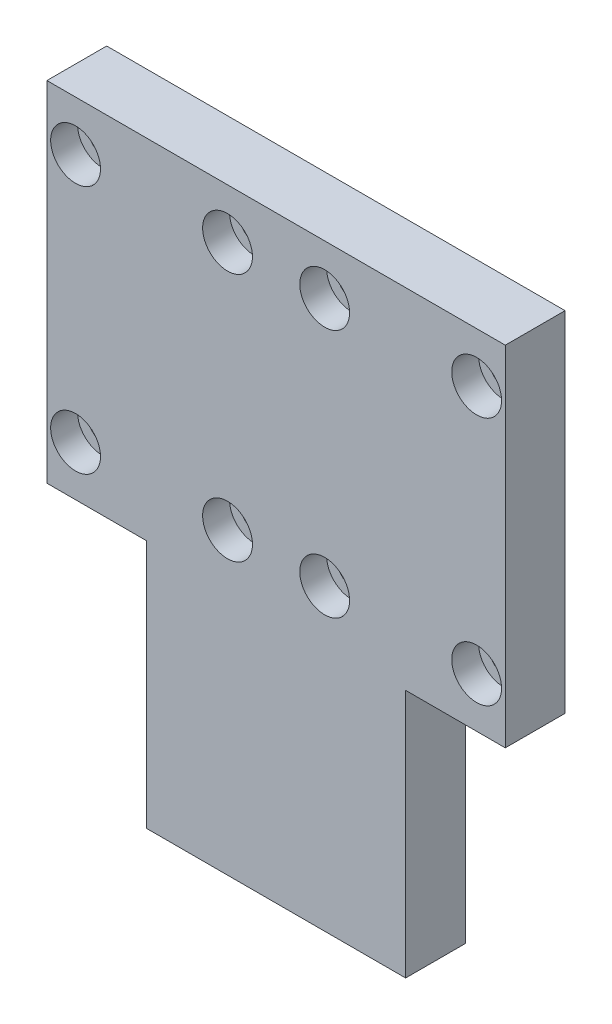
ISO-10303-21;
HEADER;
FILE_DESCRIPTION(('STEP AP214'),'2;1');
FILE_NAME('part.step','',(''),(''),'','','');
FILE_SCHEMA(('AUTOMOTIVE_DESIGN { 1 0 10303 214 1 1 1 1 }'));
ENDSEC;
DATA;
#1=APPLICATION_CONTEXT('core data for automotive mechanical design processes');
#2=APPLICATION_PROTOCOL_DEFINITION('international standard','automotive_design',2000,#1);
#3=PRODUCT_CONTEXT('',#1,'mechanical');
#4=PRODUCT('Part','Part','',(#3));
#5=PRODUCT_RELATED_PRODUCT_CATEGORY('part','',(#4));
#6=PRODUCT_DEFINITION_FORMATION('','',#4);
#7=PRODUCT_DEFINITION_CONTEXT('part definition',#1,'design');
#8=PRODUCT_DEFINITION('design','',#6,#7);
#9=PRODUCT_DEFINITION_SHAPE('','',#8);
#10=(LENGTH_UNIT() NAMED_UNIT(*) SI_UNIT(.MILLI.,.METRE.));
#11=(NAMED_UNIT(*) PLANE_ANGLE_UNIT() SI_UNIT($,.RADIAN.));
#12=(NAMED_UNIT(*) SI_UNIT($,.STERADIAN.) SOLID_ANGLE_UNIT());
#13=UNCERTAINTY_MEASURE_WITH_UNIT(LENGTH_MEASURE(1.E-05),#10,'distance_accuracy_value','');
#14=(GEOMETRIC_REPRESENTATION_CONTEXT(3) GLOBAL_UNCERTAINTY_ASSIGNED_CONTEXT((#13)) GLOBAL_UNIT_ASSIGNED_CONTEXT((#10,
#11,#12)) REPRESENTATION_CONTEXT('',''));
#15=CARTESIAN_POINT('',(0.,0.,0.));
#16=DIRECTION('',(0.,0.,1.));
#17=DIRECTION('',(1.,0.,0.));
#18=AXIS2_PLACEMENT_3D('',#15,#16,#17);
#19=CARTESIAN_POINT('',(46.,-60.,12.));
#20=DIRECTION('',(0.,1.,0.));
#21=DIRECTION('',(-1.,0.,0.));
#22=AXIS2_PLACEMENT_3D('',#19,#20,#21);
#23=PLANE('',#22);
#24=DIRECTION('',(0.,0.,1.));
#25=VECTOR('',#24,1.);
#26=CARTESIAN_POINT('',(26.,-60.,-0.000999999999999265));
#27=LINE('',#26,#25);
#28=CARTESIAN_POINT('',(26.,-60.,0.));
#29=VERTEX_POINT('',#28);
#30=CARTESIAN_POINT('',(26.,-60.,12.));
#31=VERTEX_POINT('',#30);
#32=EDGE_CURVE('E105',#29,#31,#27,.T.);
#33=ORIENTED_EDGE('',*,*,#32,.T.);
#34=DIRECTION('',(1.,0.,0.));
#35=VECTOR('',#34,1.);
#36=CARTESIAN_POINT('',(46.,-60.,12.));
#37=LINE('',#36,#35);
#38=CARTESIAN_POINT('',(-26.,-60.,12.));
#39=VERTEX_POINT('',#38);
#40=EDGE_CURVE('E137',#39,#31,#37,.T.);
#41=ORIENTED_EDGE('',*,*,#40,.F.);
#42=DIRECTION('',(0.,0.,1.));
#43=VECTOR('',#42,1.);
#44=CARTESIAN_POINT('',(-26.,-60.,-0.000999999999999265));
#45=LINE('',#44,#43);
#46=CARTESIAN_POINT('',(-26.,-60.,0.));
#47=VERTEX_POINT('',#46);
#48=EDGE_CURVE('E163',#47,#39,#45,.T.);
#49=ORIENTED_EDGE('',*,*,#48,.F.);
#50=DIRECTION('',(1.,0.,0.));
#51=VECTOR('',#50,1.);
#52=CARTESIAN_POINT('',(46.,-60.,0.));
#53=LINE('',#52,#51);
#54=EDGE_CURVE('E119',#47,#29,#53,.T.);
#55=ORIENTED_EDGE('',*,*,#54,.T.);
#56=EDGE_LOOP('',(#33,#41,#49,#55));
#57=FACE_BOUND('',#56,.T.);
#58=ADVANCED_FACE('F33',(#57),#23,.F.);
#59=CARTESIAN_POINT('',(46.,-60.,12.));
#60=DIRECTION('',(-1.,0.,0.));
#61=DIRECTION('',(0.,0.,1.));
#62=AXIS2_PLACEMENT_3D('',#59,#60,#61);
#63=PLANE('',#62);
#64=DIRECTION('',(0.,0.,1.));
#65=VECTOR('',#64,1.);
#66=CARTESIAN_POINT('',(46.,-10.,-0.000999999999999265));
#67=LINE('',#66,#65);
#68=CARTESIAN_POINT('',(46.,-10.,0.));
#69=VERTEX_POINT('',#68);
#70=CARTESIAN_POINT('',(46.,-10.,12.));
#71=VERTEX_POINT('',#70);
#72=EDGE_CURVE('E99',#69,#71,#67,.T.);
#73=ORIENTED_EDGE('',*,*,#72,.F.);
#74=DIRECTION('',(0.,1.,0.));
#75=VECTOR('',#74,1.);
#76=CARTESIAN_POINT('',(46.,-60.,0.));
#77=LINE('',#76,#75);
#78=CARTESIAN_POINT('',(46.,60.,0.));
#79=VERTEX_POINT('',#78);
#80=EDGE_CURVE('E111',#69,#79,#77,.T.);
#81=ORIENTED_EDGE('',*,*,#80,.T.);
#82=DIRECTION('',(0.,0.,-1.));
#83=VECTOR('',#82,1.);
#84=CARTESIAN_POINT('',(46.,60.,12.));
#85=LINE('',#84,#83);
#86=CARTESIAN_POINT('',(46.,60.,12.));
#87=VERTEX_POINT('',#86);
#88=EDGE_CURVE('E11',#87,#79,#85,.T.);
#89=ORIENTED_EDGE('',*,*,#88,.F.);
#90=DIRECTION('',(0.,1.,0.));
#91=VECTOR('',#90,1.);
#92=CARTESIAN_POINT('',(46.,-60.,12.));
#93=LINE('',#92,#91);
#94=EDGE_CURVE('E112',#71,#87,#93,.T.);
#95=ORIENTED_EDGE('',*,*,#94,.F.);
#96=EDGE_LOOP('',(#73,#81,#89,#95));
#97=FACE_BOUND('',#96,.T.);
#98=ADVANCED_FACE('F109',(#97),#63,.F.);
#99=CARTESIAN_POINT('',(-46.,60.,12.));
#100=DIRECTION('',(0.,0.,1.));
#101=DIRECTION('',(1.,0.,0.));
#102=AXIS2_PLACEMENT_3D('',#99,#100,#101);
#103=PLANE('',#102);
#104=CARTESIAN_POINT('',(-40.25,0.,12.));
#105=DIRECTION('',(0.,0.,1.));
#106=DIRECTION('',(1.,0.,0.));
#107=AXIS2_PLACEMENT_3D('',#104,#105,#106);
#108=CIRCLE('',#107,5.);
#109=CARTESIAN_POINT('',(-35.25,0.,12.));
#110=VERTEX_POINT('',#109);
#111=EDGE_CURVE('E265',#110,#110,#108,.T.);
#112=ORIENTED_EDGE('',*,*,#111,.F.);
#113=EDGE_LOOP('',(#112));
#114=FACE_BOUND('',#113,.T.);
#115=CARTESIAN_POINT('',(-9.74999999999999,0.,12.));
#116=DIRECTION('',(0.,0.,1.));
#117=DIRECTION('',(1.,0.,0.));
#118=AXIS2_PLACEMENT_3D('',#115,#116,#117);
#119=CIRCLE('',#118,5.);
#120=CARTESIAN_POINT('',(-4.74999999999999,0.,12.));
#121=VERTEX_POINT('',#120);
#122=EDGE_CURVE('E253',#121,#121,#119,.T.);
#123=ORIENTED_EDGE('',*,*,#122,.F.);
#124=EDGE_LOOP('',(#123));
#125=FACE_BOUND('',#124,.T.);
#126=CARTESIAN_POINT('',(-9.75,50.,12.));
#127=DIRECTION('',(0.,0.,1.));
#128=DIRECTION('',(1.,0.,0.));
#129=AXIS2_PLACEMENT_3D('',#126,#127,#128);
#130=CIRCLE('',#129,5.);
#131=CARTESIAN_POINT('',(-4.75,50.,12.));
#132=VERTEX_POINT('',#131);
#133=EDGE_CURVE('E241',#132,#132,#130,.T.);
#134=ORIENTED_EDGE('',*,*,#133,.F.);
#135=EDGE_LOOP('',(#134));
#136=FACE_BOUND('',#135,.T.);
#137=CARTESIAN_POINT('',(-40.25,50.,12.));
#138=DIRECTION('',(0.,0.,1.));
#139=DIRECTION('',(1.,0.,0.));
#140=AXIS2_PLACEMENT_3D('',#137,#138,#139);
#141=CIRCLE('',#140,5.);
#142=CARTESIAN_POINT('',(-35.25,50.,12.));
#143=VERTEX_POINT('',#142);
#144=EDGE_CURVE('E229',#143,#143,#141,.T.);
#145=ORIENTED_EDGE('',*,*,#144,.F.);
#146=EDGE_LOOP('',(#145));
#147=FACE_BOUND('',#146,.T.);
#148=CARTESIAN_POINT('',(40.25,0.,12.));
#149=DIRECTION('',(0.,0.,1.));
#150=DIRECTION('',(1.,0.,0.));
#151=AXIS2_PLACEMENT_3D('',#148,#149,#150);
#152=CIRCLE('',#151,5.);
#153=CARTESIAN_POINT('',(45.25,0.,12.));
#154=VERTEX_POINT('',#153);
#155=EDGE_CURVE('E217',#154,#154,#152,.T.);
#156=ORIENTED_EDGE('',*,*,#155,.F.);
#157=EDGE_LOOP('',(#156));
#158=FACE_BOUND('',#157,.T.);
#159=CARTESIAN_POINT('',(9.74999999999999,0.,12.));
#160=DIRECTION('',(0.,0.,1.));
#161=DIRECTION('',(1.,0.,0.));
#162=AXIS2_PLACEMENT_3D('',#159,#160,#161);
#163=CIRCLE('',#162,5.);
#164=CARTESIAN_POINT('',(14.75,0.,12.));
#165=VERTEX_POINT('',#164);
#166=EDGE_CURVE('E205',#165,#165,#163,.T.);
#167=ORIENTED_EDGE('',*,*,#166,.F.);
#168=EDGE_LOOP('',(#167));
#169=FACE_BOUND('',#168,.T.);
#170=CARTESIAN_POINT('',(9.75,50.,12.));
#171=DIRECTION('',(0.,0.,1.));
#172=DIRECTION('',(1.,0.,0.));
#173=AXIS2_PLACEMENT_3D('',#170,#171,#172);
#174=CIRCLE('',#173,5.);
#175=CARTESIAN_POINT('',(14.75,50.,12.));
#176=VERTEX_POINT('',#175);
#177=EDGE_CURVE('E193',#176,#176,#174,.T.);
#178=ORIENTED_EDGE('',*,*,#177,.F.);
#179=EDGE_LOOP('',(#178));
#180=FACE_BOUND('',#179,.T.);
#181=CARTESIAN_POINT('',(40.25,50.,12.));
#182=DIRECTION('',(0.,0.,1.));
#183=DIRECTION('',(1.,0.,0.));
#184=AXIS2_PLACEMENT_3D('',#181,#182,#183);
#185=CIRCLE('',#184,5.);
#186=CARTESIAN_POINT('',(45.25,50.,12.));
#187=VERTEX_POINT('',#186);
#188=EDGE_CURVE('E178',#187,#187,#185,.T.);
#189=ORIENTED_EDGE('',*,*,#188,.F.);
#190=EDGE_LOOP('',(#189));
#191=FACE_BOUND('',#190,.T.);
#192=ORIENTED_EDGE('',*,*,#40,.T.);
#193=DIRECTION('',(0.,1.,0.));
#194=VECTOR('',#193,1.);
#195=CARTESIAN_POINT('',(26.,-10.,12.));
#196=LINE('',#195,#194);
#197=CARTESIAN_POINT('',(26.,-10.,12.));
#198=VERTEX_POINT('',#197);
#199=EDGE_CURVE('E113',#31,#198,#196,.T.);
#200=ORIENTED_EDGE('',*,*,#199,.T.);
#201=DIRECTION('',(1.,0.,0.));
#202=VECTOR('',#201,1.);
#203=CARTESIAN_POINT('',(46.,-10.,12.));
#204=LINE('',#203,#202);
#205=EDGE_CURVE('E488',#198,#71,#204,.T.);
#206=ORIENTED_EDGE('',*,*,#205,.T.);
#207=ORIENTED_EDGE('',*,*,#94,.T.);
#208=DIRECTION('',(-1.,0.,0.));
#209=VECTOR('',#208,1.);
#210=CARTESIAN_POINT('',(46.,60.,12.));
#211=LINE('',#210,#209);
#212=CARTESIAN_POINT('',(-46.,60.,12.));
#213=VERTEX_POINT('',#212);
#214=EDGE_CURVE('E128',#87,#213,#211,.T.);
#215=ORIENTED_EDGE('',*,*,#214,.T.);
#216=DIRECTION('',(0.,-1.,0.));
#217=VECTOR('',#216,1.);
#218=CARTESIAN_POINT('',(-46.,-60.,12.));
#219=LINE('',#218,#217);
#220=CARTESIAN_POINT('',(-46.,-10.,12.));
#221=VERTEX_POINT('',#220);
#222=EDGE_CURVE('E121',#213,#221,#219,.T.);
#223=ORIENTED_EDGE('',*,*,#222,.T.);
#224=DIRECTION('',(-1.,0.,0.));
#225=VECTOR('',#224,1.);
#226=CARTESIAN_POINT('',(-46.,-10.,12.));
#227=LINE('',#226,#225);
#228=CARTESIAN_POINT('',(-26.,-10.,12.));
#229=VERTEX_POINT('',#228);
#230=EDGE_CURVE('E174',#229,#221,#227,.T.);
#231=ORIENTED_EDGE('',*,*,#230,.F.);
#232=DIRECTION('',(0.,1.,0.));
#233=VECTOR('',#232,1.);
#234=CARTESIAN_POINT('',(-26.,-10.,12.));
#235=LINE('',#234,#233);
#236=EDGE_CURVE('E159',#39,#229,#235,.T.);
#237=ORIENTED_EDGE('',*,*,#236,.F.);
#238=EDGE_LOOP('',(#192,#200,#206,#207,#215,#223,#231,#237));
#239=FACE_BOUND('',#238,.T.);
#240=ADVANCED_FACE('F156',(#114,#125,#136,#147,#158,#169,#180,#191,#239),#103,.T.);
#241=CARTESIAN_POINT('',(-46.,60.,0.));
#242=DIRECTION('',(0.,0.,1.));
#243=DIRECTION('',(1.,0.,0.));
#244=AXIS2_PLACEMENT_3D('',#241,#242,#243);
#245=PLANE('',#244);
#246=CARTESIAN_POINT('',(-40.25,0.,0.));
#247=DIRECTION('',(0.,0.,1.));
#248=DIRECTION('',(1.,0.,0.));
#249=AXIS2_PLACEMENT_3D('',#246,#247,#248);
#250=CIRCLE('',#249,2.75);
#251=CARTESIAN_POINT('',(-37.5,0.,0.));
#252=VERTEX_POINT('',#251);
#253=EDGE_CURVE('E140',#252,#252,#250,.T.);
#254=ORIENTED_EDGE('',*,*,#253,.T.);
#255=EDGE_LOOP('',(#254));
#256=FACE_BOUND('',#255,.T.);
#257=CARTESIAN_POINT('',(-9.74999999999999,0.,0.));
#258=DIRECTION('',(0.,0.,1.));
#259=DIRECTION('',(1.,0.,0.));
#260=AXIS2_PLACEMENT_3D('',#257,#258,#259);
#261=CIRCLE('',#260,2.75);
#262=CARTESIAN_POINT('',(-7.,0.,0.));
#263=VERTEX_POINT('',#262);
#264=EDGE_CURVE('E262',#263,#263,#261,.T.);
#265=ORIENTED_EDGE('',*,*,#264,.T.);
#266=EDGE_LOOP('',(#265));
#267=FACE_BOUND('',#266,.T.);
#268=CARTESIAN_POINT('',(-9.75,50.,0.));
#269=DIRECTION('',(0.,0.,1.));
#270=DIRECTION('',(1.,0.,0.));
#271=AXIS2_PLACEMENT_3D('',#268,#269,#270);
#272=CIRCLE('',#271,2.75);
#273=CARTESIAN_POINT('',(-7.,50.,0.));
#274=VERTEX_POINT('',#273);
#275=EDGE_CURVE('E250',#274,#274,#272,.T.);
#276=ORIENTED_EDGE('',*,*,#275,.T.);
#277=EDGE_LOOP('',(#276));
#278=FACE_BOUND('',#277,.T.);
#279=CARTESIAN_POINT('',(-40.25,50.,0.));
#280=DIRECTION('',(0.,0.,1.));
#281=DIRECTION('',(1.,0.,0.));
#282=AXIS2_PLACEMENT_3D('',#279,#280,#281);
#283=CIRCLE('',#282,2.75);
#284=CARTESIAN_POINT('',(-37.5,50.,0.));
#285=VERTEX_POINT('',#284);
#286=EDGE_CURVE('E238',#285,#285,#283,.T.);
#287=ORIENTED_EDGE('',*,*,#286,.T.);
#288=EDGE_LOOP('',(#287));
#289=FACE_BOUND('',#288,.T.);
#290=CARTESIAN_POINT('',(40.25,0.,0.));
#291=DIRECTION('',(0.,0.,1.));
#292=DIRECTION('',(1.,0.,0.));
#293=AXIS2_PLACEMENT_3D('',#290,#291,#292);
#294=CIRCLE('',#293,2.75);
#295=CARTESIAN_POINT('',(43.,0.,0.));
#296=VERTEX_POINT('',#295);
#297=EDGE_CURVE('E226',#296,#296,#294,.T.);
#298=ORIENTED_EDGE('',*,*,#297,.T.);
#299=EDGE_LOOP('',(#298));
#300=FACE_BOUND('',#299,.T.);
#301=CARTESIAN_POINT('',(9.74999999999999,0.,0.));
#302=DIRECTION('',(0.,0.,1.));
#303=DIRECTION('',(1.,0.,0.));
#304=AXIS2_PLACEMENT_3D('',#301,#302,#303);
#305=CIRCLE('',#304,2.75);
#306=CARTESIAN_POINT('',(12.5,0.,0.));
#307=VERTEX_POINT('',#306);
#308=EDGE_CURVE('E214',#307,#307,#305,.T.);
#309=ORIENTED_EDGE('',*,*,#308,.T.);
#310=EDGE_LOOP('',(#309));
#311=FACE_BOUND('',#310,.T.);
#312=CARTESIAN_POINT('',(9.75,50.,0.));
#313=DIRECTION('',(0.,0.,1.));
#314=DIRECTION('',(1.,0.,0.));
#315=AXIS2_PLACEMENT_3D('',#312,#313,#314);
#316=CIRCLE('',#315,2.75);
#317=CARTESIAN_POINT('',(12.5,50.,0.));
#318=VERTEX_POINT('',#317);
#319=EDGE_CURVE('E202',#318,#318,#316,.T.);
#320=ORIENTED_EDGE('',*,*,#319,.T.);
#321=EDGE_LOOP('',(#320));
#322=FACE_BOUND('',#321,.T.);
#323=CARTESIAN_POINT('',(40.25,50.,0.));
#324=DIRECTION('',(0.,0.,1.));
#325=DIRECTION('',(1.,0.,0.));
#326=AXIS2_PLACEMENT_3D('',#323,#324,#325);
#327=CIRCLE('',#326,2.75);
#328=CARTESIAN_POINT('',(43.,50.,0.));
#329=VERTEX_POINT('',#328);
#330=EDGE_CURVE('E190',#329,#329,#327,.T.);
#331=ORIENTED_EDGE('',*,*,#330,.T.);
#332=EDGE_LOOP('',(#331));
#333=FACE_BOUND('',#332,.T.);
#334=DIRECTION('',(0.,-1.,0.));
#335=VECTOR('',#334,1.);
#336=CARTESIAN_POINT('',(26.,-10.,0.));
#337=LINE('',#336,#335);
#338=CARTESIAN_POINT('',(26.,-10.,0.));
#339=VERTEX_POINT('',#338);
#340=EDGE_CURVE('E487',#339,#29,#337,.T.);
#341=ORIENTED_EDGE('',*,*,#340,.T.);
#342=ORIENTED_EDGE('',*,*,#54,.F.);
#343=DIRECTION('',(0.,-1.,0.));
#344=VECTOR('',#343,1.);
#345=CARTESIAN_POINT('',(-26.,-10.,0.));
#346=LINE('',#345,#344);
#347=CARTESIAN_POINT('',(-26.,-10.,0.));
#348=VERTEX_POINT('',#347);
#349=EDGE_CURVE('E104',#348,#47,#346,.T.);
#350=ORIENTED_EDGE('',*,*,#349,.F.);
#351=DIRECTION('',(1.,0.,0.));
#352=VECTOR('',#351,1.);
#353=CARTESIAN_POINT('',(-46.,-10.,0.));
#354=LINE('',#353,#352);
#355=CARTESIAN_POINT('',(-46.,-10.,0.));
#356=VERTEX_POINT('',#355);
#357=EDGE_CURVE('E56',#356,#348,#354,.T.);
#358=ORIENTED_EDGE('',*,*,#357,.F.);
#359=DIRECTION('',(0.,-1.,0.));
#360=VECTOR('',#359,1.);
#361=CARTESIAN_POINT('',(-46.,-60.,0.));
#362=LINE('',#361,#360);
#363=CARTESIAN_POINT('',(-46.,60.,0.));
#364=VERTEX_POINT('',#363);
#365=EDGE_CURVE('E124',#364,#356,#362,.T.);
#366=ORIENTED_EDGE('',*,*,#365,.F.);
#367=DIRECTION('',(-1.,0.,0.));
#368=VECTOR('',#367,1.);
#369=CARTESIAN_POINT('',(46.,60.,0.));
#370=LINE('',#369,#368);
#371=EDGE_CURVE('E118',#79,#364,#370,.T.);
#372=ORIENTED_EDGE('',*,*,#371,.F.);
#373=ORIENTED_EDGE('',*,*,#80,.F.);
#374=DIRECTION('',(-1.,0.,0.));
#375=VECTOR('',#374,1.);
#376=CARTESIAN_POINT('',(46.,-10.,0.));
#377=LINE('',#376,#375);
#378=EDGE_CURVE('E96',#69,#339,#377,.T.);
#379=ORIENTED_EDGE('',*,*,#378,.T.);
#380=EDGE_LOOP('',(#341,#342,#350,#358,#366,#372,#373,#379));
#381=FACE_BOUND('',#380,.T.);
#382=ADVANCED_FACE('F116',(#256,#267,#278,#289,#300,#311,#322,#333,#381),#245,.F.);
#383=CARTESIAN_POINT('',(-46.,-60.,12.));
#384=DIRECTION('',(1.,0.,0.));
#385=DIRECTION('',(0.,0.,-1.));
#386=AXIS2_PLACEMENT_3D('',#383,#384,#385);
#387=PLANE('',#386);
#388=ORIENTED_EDGE('',*,*,#365,.T.);
#389=DIRECTION('',(0.,0.,1.));
#390=VECTOR('',#389,1.);
#391=CARTESIAN_POINT('',(-46.,-10.,-0.000999999999999265));
#392=LINE('',#391,#390);
#393=EDGE_CURVE('E176',#356,#221,#392,.T.);
#394=ORIENTED_EDGE('',*,*,#393,.T.);
#395=ORIENTED_EDGE('',*,*,#222,.F.);
#396=DIRECTION('',(0.,0.,-1.));
#397=VECTOR('',#396,1.);
#398=CARTESIAN_POINT('',(-46.,60.,12.));
#399=LINE('',#398,#397);
#400=EDGE_CURVE('E41',#213,#364,#399,.T.);
#401=ORIENTED_EDGE('',*,*,#400,.T.);
#402=EDGE_LOOP('',(#388,#394,#395,#401));
#403=FACE_BOUND('',#402,.T.);
#404=ADVANCED_FACE('F35',(#403),#387,.F.);
#405=CARTESIAN_POINT('',(46.,60.,12.));
#406=DIRECTION('',(0.,-1.,0.));
#407=DIRECTION('',(1.,0.,0.));
#408=AXIS2_PLACEMENT_3D('',#405,#406,#407);
#409=PLANE('',#408);
#410=ORIENTED_EDGE('',*,*,#371,.T.);
#411=ORIENTED_EDGE('',*,*,#400,.F.);
#412=ORIENTED_EDGE('',*,*,#214,.F.);
#413=ORIENTED_EDGE('',*,*,#88,.T.);
#414=EDGE_LOOP('',(#410,#411,#412,#413));
#415=FACE_BOUND('',#414,.T.);
#416=ADVANCED_FACE('F319',(#415),#409,.F.);
#417=CARTESIAN_POINT('',(-40.25,0.,12.));
#418=DIRECTION('',(0.,0.,1.));
#419=DIRECTION('',(1.,0.,0.));
#420=AXIS2_PLACEMENT_3D('',#417,#418,#419);
#421=CYLINDRICAL_SURFACE('',#420,2.75);
#422=ORIENTED_EDGE('',*,*,#253,.F.);
#423=EDGE_LOOP('',(#422));
#424=FACE_BOUND('',#423,.T.);
#425=CARTESIAN_POINT('',(-40.25,0.,6.6));
#426=DIRECTION('',(0.,0.,1.));
#427=DIRECTION('',(1.,0.,0.));
#428=AXIS2_PLACEMENT_3D('',#425,#426,#427);
#429=CIRCLE('',#428,2.75);
#430=CARTESIAN_POINT('',(-37.5,0.,6.6));
#431=VERTEX_POINT('',#430);
#432=EDGE_CURVE('E143',#431,#431,#429,.T.);
#433=ORIENTED_EDGE('',*,*,#432,.T.);
#434=EDGE_LOOP('',(#433));
#435=FACE_BOUND('',#434,.T.);
#436=ADVANCED_FACE('F322',(#424,#435),#421,.F.);
#437=CARTESIAN_POINT('',(-37.5,0.,6.6));
#438=DIRECTION('',(0.,0.,-1.));
#439=DIRECTION('',(-1.,0.,0.));
#440=AXIS2_PLACEMENT_3D('',#437,#438,#439);
#441=PLANE('',#440);
#442=ORIENTED_EDGE('',*,*,#432,.F.);
#443=EDGE_LOOP('',(#442));
#444=FACE_BOUND('',#443,.T.);
#445=CARTESIAN_POINT('',(-40.25,0.,6.6));
#446=DIRECTION('',(0.,0.,1.));
#447=DIRECTION('',(1.,0.,0.));
#448=AXIS2_PLACEMENT_3D('',#445,#446,#447);
#449=CIRCLE('',#448,5.);
#450=CARTESIAN_POINT('',(-35.25,0.,6.6));
#451=VERTEX_POINT('',#450);
#452=EDGE_CURVE('E148',#451,#451,#449,.T.);
#453=ORIENTED_EDGE('',*,*,#452,.T.);
#454=EDGE_LOOP('',(#453));
#455=FACE_BOUND('',#454,.T.);
#456=ADVANCED_FACE('F270',(#444,#455),#441,.F.);
#457=CARTESIAN_POINT('',(-40.25,0.,12.));
#458=DIRECTION('',(0.,0.,1.));
#459=DIRECTION('',(1.,0.,0.));
#460=AXIS2_PLACEMENT_3D('',#457,#458,#459);
#461=CYLINDRICAL_SURFACE('',#460,5.);
#462=ORIENTED_EDGE('',*,*,#452,.F.);
#463=EDGE_LOOP('',(#462));
#464=FACE_BOUND('',#463,.T.);
#465=ORIENTED_EDGE('',*,*,#111,.T.);
#466=EDGE_LOOP('',(#465));
#467=FACE_BOUND('',#466,.T.);
#468=ADVANCED_FACE('F272',(#464,#467),#461,.F.);
#469=CARTESIAN_POINT('',(-9.74999999999999,0.,12.));
#470=DIRECTION('',(0.,0.,1.));
#471=DIRECTION('',(1.,0.,0.));
#472=AXIS2_PLACEMENT_3D('',#469,#470,#471);
#473=CYLINDRICAL_SURFACE('',#472,2.75);
#474=ORIENTED_EDGE('',*,*,#264,.F.);
#475=EDGE_LOOP('',(#474));
#476=FACE_BOUND('',#475,.T.);
#477=CARTESIAN_POINT('',(-9.74999999999999,0.,6.6));
#478=DIRECTION('',(0.,0.,1.));
#479=DIRECTION('',(1.,0.,0.));
#480=AXIS2_PLACEMENT_3D('',#477,#478,#479);
#481=CIRCLE('',#480,2.75);
#482=CARTESIAN_POINT('',(-6.99999999999999,0.,6.6));
#483=VERTEX_POINT('',#482);
#484=EDGE_CURVE('E259',#483,#483,#481,.T.);
#485=ORIENTED_EDGE('',*,*,#484,.T.);
#486=EDGE_LOOP('',(#485));
#487=FACE_BOUND('',#486,.T.);
#488=ADVANCED_FACE('F275',(#476,#487),#473,.F.);
#489=CARTESIAN_POINT('',(-6.99999999999999,0.,6.6));
#490=DIRECTION('',(0.,0.,-1.));
#491=DIRECTION('',(-1.,0.,0.));
#492=AXIS2_PLACEMENT_3D('',#489,#490,#491);
#493=PLANE('',#492);
#494=ORIENTED_EDGE('',*,*,#484,.F.);
#495=EDGE_LOOP('',(#494));
#496=FACE_BOUND('',#495,.T.);
#497=CARTESIAN_POINT('',(-9.74999999999999,0.,6.6));
#498=DIRECTION('',(0.,0.,1.));
#499=DIRECTION('',(1.,0.,0.));
#500=AXIS2_PLACEMENT_3D('',#497,#498,#499);
#501=CIRCLE('',#500,5.);
#502=CARTESIAN_POINT('',(-4.75,0.,6.6));
#503=VERTEX_POINT('',#502);
#504=EDGE_CURVE('E256',#503,#503,#501,.T.);
#505=ORIENTED_EDGE('',*,*,#504,.T.);
#506=EDGE_LOOP('',(#505));
#507=FACE_BOUND('',#506,.T.);
#508=ADVANCED_FACE('F334',(#496,#507),#493,.F.);
#509=CARTESIAN_POINT('',(-9.74999999999999,0.,12.));
#510=DIRECTION('',(0.,0.,1.));
#511=DIRECTION('',(1.,0.,0.));
#512=AXIS2_PLACEMENT_3D('',#509,#510,#511);
#513=CYLINDRICAL_SURFACE('',#512,5.);
#514=ORIENTED_EDGE('',*,*,#504,.F.);
#515=EDGE_LOOP('',(#514));
#516=FACE_BOUND('',#515,.T.);
#517=ORIENTED_EDGE('',*,*,#122,.T.);
#518=EDGE_LOOP('',(#517));
#519=FACE_BOUND('',#518,.T.);
#520=ADVANCED_FACE('F338',(#516,#519),#513,.F.);
#521=CARTESIAN_POINT('',(-9.75,50.,12.));
#522=DIRECTION('',(0.,0.,1.));
#523=DIRECTION('',(1.,0.,0.));
#524=AXIS2_PLACEMENT_3D('',#521,#522,#523);
#525=CYLINDRICAL_SURFACE('',#524,2.75);
#526=ORIENTED_EDGE('',*,*,#275,.F.);
#527=EDGE_LOOP('',(#526));
#528=FACE_BOUND('',#527,.T.);
#529=CARTESIAN_POINT('',(-9.75,50.,6.6));
#530=DIRECTION('',(0.,0.,1.));
#531=DIRECTION('',(1.,0.,0.));
#532=AXIS2_PLACEMENT_3D('',#529,#530,#531);
#533=CIRCLE('',#532,2.75);
#534=CARTESIAN_POINT('',(-7.,50.,6.6));
#535=VERTEX_POINT('',#534);
#536=EDGE_CURVE('E247',#535,#535,#533,.T.);
#537=ORIENTED_EDGE('',*,*,#536,.T.);
#538=EDGE_LOOP('',(#537));
#539=FACE_BOUND('',#538,.T.);
#540=ADVANCED_FACE('F342',(#528,#539),#525,.F.);
#541=CARTESIAN_POINT('',(-7.,50.,6.6));
#542=DIRECTION('',(0.,0.,-1.));
#543=DIRECTION('',(-1.,0.,0.));
#544=AXIS2_PLACEMENT_3D('',#541,#542,#543);
#545=PLANE('',#544);
#546=ORIENTED_EDGE('',*,*,#536,.F.);
#547=EDGE_LOOP('',(#546));
#548=FACE_BOUND('',#547,.T.);
#549=CARTESIAN_POINT('',(-9.75,50.,6.6));
#550=DIRECTION('',(0.,0.,1.));
#551=DIRECTION('',(1.,0.,0.));
#552=AXIS2_PLACEMENT_3D('',#549,#550,#551);
#553=CIRCLE('',#552,5.);
#554=CARTESIAN_POINT('',(-4.75,50.,6.6));
#555=VERTEX_POINT('',#554);
#556=EDGE_CURVE('E244',#555,#555,#553,.T.);
#557=ORIENTED_EDGE('',*,*,#556,.T.);
#558=EDGE_LOOP('',(#557));
#559=FACE_BOUND('',#558,.T.);
#560=ADVANCED_FACE('F346',(#548,#559),#545,.F.);
#561=CARTESIAN_POINT('',(-9.75,50.,12.));
#562=DIRECTION('',(0.,0.,1.));
#563=DIRECTION('',(1.,0.,0.));
#564=AXIS2_PLACEMENT_3D('',#561,#562,#563);
#565=CYLINDRICAL_SURFACE('',#564,5.);
#566=ORIENTED_EDGE('',*,*,#556,.F.);
#567=EDGE_LOOP('',(#566));
#568=FACE_BOUND('',#567,.T.);
#569=ORIENTED_EDGE('',*,*,#133,.T.);
#570=EDGE_LOOP('',(#569));
#571=FACE_BOUND('',#570,.T.);
#572=ADVANCED_FACE('F350',(#568,#571),#565,.F.);
#573=CARTESIAN_POINT('',(-40.25,50.,12.));
#574=DIRECTION('',(0.,0.,1.));
#575=DIRECTION('',(1.,0.,0.));
#576=AXIS2_PLACEMENT_3D('',#573,#574,#575);
#577=CYLINDRICAL_SURFACE('',#576,2.75);
#578=ORIENTED_EDGE('',*,*,#286,.F.);
#579=EDGE_LOOP('',(#578));
#580=FACE_BOUND('',#579,.T.);
#581=CARTESIAN_POINT('',(-40.25,50.,6.6));
#582=DIRECTION('',(0.,0.,1.));
#583=DIRECTION('',(1.,0.,0.));
#584=AXIS2_PLACEMENT_3D('',#581,#582,#583);
#585=CIRCLE('',#584,2.75);
#586=CARTESIAN_POINT('',(-37.5,50.,6.6));
#587=VERTEX_POINT('',#586);
#588=EDGE_CURVE('E235',#587,#587,#585,.T.);
#589=ORIENTED_EDGE('',*,*,#588,.T.);
#590=EDGE_LOOP('',(#589));
#591=FACE_BOUND('',#590,.T.);
#592=ADVANCED_FACE('F354',(#580,#591),#577,.F.);
#593=CARTESIAN_POINT('',(-37.5,50.,6.6));
#594=DIRECTION('',(0.,0.,-1.));
#595=DIRECTION('',(-1.,0.,0.));
#596=AXIS2_PLACEMENT_3D('',#593,#594,#595);
#597=PLANE('',#596);
#598=ORIENTED_EDGE('',*,*,#588,.F.);
#599=EDGE_LOOP('',(#598));
#600=FACE_BOUND('',#599,.T.);
#601=CARTESIAN_POINT('',(-40.25,50.,6.6));
#602=DIRECTION('',(0.,0.,1.));
#603=DIRECTION('',(1.,0.,0.));
#604=AXIS2_PLACEMENT_3D('',#601,#602,#603);
#605=CIRCLE('',#604,5.);
#606=CARTESIAN_POINT('',(-35.25,50.,6.6));
#607=VERTEX_POINT('',#606);
#608=EDGE_CURVE('E232',#607,#607,#605,.T.);
#609=ORIENTED_EDGE('',*,*,#608,.T.);
#610=EDGE_LOOP('',(#609));
#611=FACE_BOUND('',#610,.T.);
#612=ADVANCED_FACE('F358',(#600,#611),#597,.F.);
#613=CARTESIAN_POINT('',(-40.25,50.,12.));
#614=DIRECTION('',(0.,0.,1.));
#615=DIRECTION('',(1.,0.,0.));
#616=AXIS2_PLACEMENT_3D('',#613,#614,#615);
#617=CYLINDRICAL_SURFACE('',#616,5.);
#618=ORIENTED_EDGE('',*,*,#608,.F.);
#619=EDGE_LOOP('',(#618));
#620=FACE_BOUND('',#619,.T.);
#621=ORIENTED_EDGE('',*,*,#144,.T.);
#622=EDGE_LOOP('',(#621));
#623=FACE_BOUND('',#622,.T.);
#624=ADVANCED_FACE('F362',(#620,#623),#617,.F.);
#625=CARTESIAN_POINT('',(40.25,0.,12.));
#626=DIRECTION('',(0.,0.,1.));
#627=DIRECTION('',(1.,0.,0.));
#628=AXIS2_PLACEMENT_3D('',#625,#626,#627);
#629=CYLINDRICAL_SURFACE('',#628,2.75);
#630=ORIENTED_EDGE('',*,*,#297,.F.);
#631=EDGE_LOOP('',(#630));
#632=FACE_BOUND('',#631,.T.);
#633=CARTESIAN_POINT('',(40.25,0.,6.6));
#634=DIRECTION('',(0.,0.,1.));
#635=DIRECTION('',(1.,0.,0.));
#636=AXIS2_PLACEMENT_3D('',#633,#634,#635);
#637=CIRCLE('',#636,2.75);
#638=CARTESIAN_POINT('',(43.,0.,6.6));
#639=VERTEX_POINT('',#638);
#640=EDGE_CURVE('E223',#639,#639,#637,.T.);
#641=ORIENTED_EDGE('',*,*,#640,.T.);
#642=EDGE_LOOP('',(#641));
#643=FACE_BOUND('',#642,.T.);
#644=ADVANCED_FACE('F366',(#632,#643),#629,.F.);
#645=CARTESIAN_POINT('',(43.,0.,6.6));
#646=DIRECTION('',(0.,0.,-1.));
#647=DIRECTION('',(-1.,0.,0.));
#648=AXIS2_PLACEMENT_3D('',#645,#646,#647);
#649=PLANE('',#648);
#650=ORIENTED_EDGE('',*,*,#640,.F.);
#651=EDGE_LOOP('',(#650));
#652=FACE_BOUND('',#651,.T.);
#653=CARTESIAN_POINT('',(40.25,0.,6.6));
#654=DIRECTION('',(0.,0.,1.));
#655=DIRECTION('',(1.,0.,0.));
#656=AXIS2_PLACEMENT_3D('',#653,#654,#655);
#657=CIRCLE('',#656,5.);
#658=CARTESIAN_POINT('',(45.25,0.,6.6));
#659=VERTEX_POINT('',#658);
#660=EDGE_CURVE('E220',#659,#659,#657,.T.);
#661=ORIENTED_EDGE('',*,*,#660,.T.);
#662=EDGE_LOOP('',(#661));
#663=FACE_BOUND('',#662,.T.);
#664=ADVANCED_FACE('F370',(#652,#663),#649,.F.);
#665=CARTESIAN_POINT('',(40.25,0.,12.));
#666=DIRECTION('',(0.,0.,1.));
#667=DIRECTION('',(1.,0.,0.));
#668=AXIS2_PLACEMENT_3D('',#665,#666,#667);
#669=CYLINDRICAL_SURFACE('',#668,5.);
#670=ORIENTED_EDGE('',*,*,#660,.F.);
#671=EDGE_LOOP('',(#670));
#672=FACE_BOUND('',#671,.T.);
#673=ORIENTED_EDGE('',*,*,#155,.T.);
#674=EDGE_LOOP('',(#673));
#675=FACE_BOUND('',#674,.T.);
#676=ADVANCED_FACE('F374',(#672,#675),#669,.F.);
#677=CARTESIAN_POINT('',(9.74999999999999,0.,12.));
#678=DIRECTION('',(0.,0.,1.));
#679=DIRECTION('',(1.,0.,0.));
#680=AXIS2_PLACEMENT_3D('',#677,#678,#679);
#681=CYLINDRICAL_SURFACE('',#680,2.75);
#682=ORIENTED_EDGE('',*,*,#308,.F.);
#683=EDGE_LOOP('',(#682));
#684=FACE_BOUND('',#683,.T.);
#685=CARTESIAN_POINT('',(9.74999999999999,0.,6.6));
#686=DIRECTION('',(0.,0.,1.));
#687=DIRECTION('',(1.,0.,0.));
#688=AXIS2_PLACEMENT_3D('',#685,#686,#687);
#689=CIRCLE('',#688,2.75);
#690=CARTESIAN_POINT('',(12.5,0.,6.6));
#691=VERTEX_POINT('',#690);
#692=EDGE_CURVE('E211',#691,#691,#689,.T.);
#693=ORIENTED_EDGE('',*,*,#692,.T.);
#694=EDGE_LOOP('',(#693));
#695=FACE_BOUND('',#694,.T.);
#696=ADVANCED_FACE('F378',(#684,#695),#681,.F.);
#697=CARTESIAN_POINT('',(12.5,0.,6.6));
#698=DIRECTION('',(0.,0.,-1.));
#699=DIRECTION('',(-1.,0.,0.));
#700=AXIS2_PLACEMENT_3D('',#697,#698,#699);
#701=PLANE('',#700);
#702=ORIENTED_EDGE('',*,*,#692,.F.);
#703=EDGE_LOOP('',(#702));
#704=FACE_BOUND('',#703,.T.);
#705=CARTESIAN_POINT('',(9.74999999999999,0.,6.6));
#706=DIRECTION('',(0.,0.,1.));
#707=DIRECTION('',(1.,0.,0.));
#708=AXIS2_PLACEMENT_3D('',#705,#706,#707);
#709=CIRCLE('',#708,5.);
#710=CARTESIAN_POINT('',(14.75,0.,6.6));
#711=VERTEX_POINT('',#710);
#712=EDGE_CURVE('E208',#711,#711,#709,.T.);
#713=ORIENTED_EDGE('',*,*,#712,.T.);
#714=EDGE_LOOP('',(#713));
#715=FACE_BOUND('',#714,.T.);
#716=ADVANCED_FACE('F382',(#704,#715),#701,.F.);
#717=CARTESIAN_POINT('',(9.74999999999999,0.,12.));
#718=DIRECTION('',(0.,0.,1.));
#719=DIRECTION('',(1.,0.,0.));
#720=AXIS2_PLACEMENT_3D('',#717,#718,#719);
#721=CYLINDRICAL_SURFACE('',#720,5.);
#722=ORIENTED_EDGE('',*,*,#712,.F.);
#723=EDGE_LOOP('',(#722));
#724=FACE_BOUND('',#723,.T.);
#725=ORIENTED_EDGE('',*,*,#166,.T.);
#726=EDGE_LOOP('',(#725));
#727=FACE_BOUND('',#726,.T.);
#728=ADVANCED_FACE('F386',(#724,#727),#721,.F.);
#729=CARTESIAN_POINT('',(9.75,50.,12.));
#730=DIRECTION('',(0.,0.,1.));
#731=DIRECTION('',(1.,0.,0.));
#732=AXIS2_PLACEMENT_3D('',#729,#730,#731);
#733=CYLINDRICAL_SURFACE('',#732,2.75);
#734=ORIENTED_EDGE('',*,*,#319,.F.);
#735=EDGE_LOOP('',(#734));
#736=FACE_BOUND('',#735,.T.);
#737=CARTESIAN_POINT('',(9.75,50.,6.6));
#738=DIRECTION('',(0.,0.,1.));
#739=DIRECTION('',(1.,0.,0.));
#740=AXIS2_PLACEMENT_3D('',#737,#738,#739);
#741=CIRCLE('',#740,2.75);
#742=CARTESIAN_POINT('',(12.5,50.,6.6));
#743=VERTEX_POINT('',#742);
#744=EDGE_CURVE('E199',#743,#743,#741,.T.);
#745=ORIENTED_EDGE('',*,*,#744,.T.);
#746=EDGE_LOOP('',(#745));
#747=FACE_BOUND('',#746,.T.);
#748=ADVANCED_FACE('F390',(#736,#747),#733,.F.);
#749=CARTESIAN_POINT('',(12.5,50.,6.6));
#750=DIRECTION('',(0.,0.,-1.));
#751=DIRECTION('',(-1.,0.,0.));
#752=AXIS2_PLACEMENT_3D('',#749,#750,#751);
#753=PLANE('',#752);
#754=ORIENTED_EDGE('',*,*,#744,.F.);
#755=EDGE_LOOP('',(#754));
#756=FACE_BOUND('',#755,.T.);
#757=CARTESIAN_POINT('',(9.75,50.,6.6));
#758=DIRECTION('',(0.,0.,1.));
#759=DIRECTION('',(1.,0.,0.));
#760=AXIS2_PLACEMENT_3D('',#757,#758,#759);
#761=CIRCLE('',#760,5.);
#762=CARTESIAN_POINT('',(14.75,50.,6.6));
#763=VERTEX_POINT('',#762);
#764=EDGE_CURVE('E196',#763,#763,#761,.T.);
#765=ORIENTED_EDGE('',*,*,#764,.T.);
#766=EDGE_LOOP('',(#765));
#767=FACE_BOUND('',#766,.T.);
#768=ADVANCED_FACE('F394',(#756,#767),#753,.F.);
#769=CARTESIAN_POINT('',(9.75,50.,12.));
#770=DIRECTION('',(0.,0.,1.));
#771=DIRECTION('',(1.,0.,0.));
#772=AXIS2_PLACEMENT_3D('',#769,#770,#771);
#773=CYLINDRICAL_SURFACE('',#772,5.);
#774=ORIENTED_EDGE('',*,*,#764,.F.);
#775=EDGE_LOOP('',(#774));
#776=FACE_BOUND('',#775,.T.);
#777=ORIENTED_EDGE('',*,*,#177,.T.);
#778=EDGE_LOOP('',(#777));
#779=FACE_BOUND('',#778,.T.);
#780=ADVANCED_FACE('F398',(#776,#779),#773,.F.);
#781=CARTESIAN_POINT('',(40.25,50.,12.));
#782=DIRECTION('',(0.,0.,1.));
#783=DIRECTION('',(1.,0.,0.));
#784=AXIS2_PLACEMENT_3D('',#781,#782,#783);
#785=CYLINDRICAL_SURFACE('',#784,2.75);
#786=ORIENTED_EDGE('',*,*,#330,.F.);
#787=EDGE_LOOP('',(#786));
#788=FACE_BOUND('',#787,.T.);
#789=CARTESIAN_POINT('',(40.25,50.,6.6));
#790=DIRECTION('',(0.,0.,1.));
#791=DIRECTION('',(1.,0.,0.));
#792=AXIS2_PLACEMENT_3D('',#789,#790,#791);
#793=CIRCLE('',#792,2.75);
#794=CARTESIAN_POINT('',(43.,50.,6.6));
#795=VERTEX_POINT('',#794);
#796=EDGE_CURVE('E187',#795,#795,#793,.T.);
#797=ORIENTED_EDGE('',*,*,#796,.T.);
#798=EDGE_LOOP('',(#797));
#799=FACE_BOUND('',#798,.T.);
#800=ADVANCED_FACE('F308',(#788,#799),#785,.F.);
#801=CARTESIAN_POINT('',(43.,50.,6.6));
#802=DIRECTION('',(0.,0.,-1.));
#803=DIRECTION('',(-1.,0.,0.));
#804=AXIS2_PLACEMENT_3D('',#801,#802,#803);
#805=PLANE('',#804);
#806=ORIENTED_EDGE('',*,*,#796,.F.);
#807=EDGE_LOOP('',(#806));
#808=FACE_BOUND('',#807,.T.);
#809=CARTESIAN_POINT('',(40.25,50.,6.6));
#810=DIRECTION('',(0.,0.,1.));
#811=DIRECTION('',(1.,0.,0.));
#812=AXIS2_PLACEMENT_3D('',#809,#810,#811);
#813=CIRCLE('',#812,5.);
#814=CARTESIAN_POINT('',(45.25,50.,6.6));
#815=VERTEX_POINT('',#814);
#816=EDGE_CURVE('E184',#815,#815,#813,.T.);
#817=ORIENTED_EDGE('',*,*,#816,.T.);
#818=EDGE_LOOP('',(#817));
#819=FACE_BOUND('',#818,.T.);
#820=ADVANCED_FACE('F299',(#808,#819),#805,.F.);
#821=CARTESIAN_POINT('',(40.25,50.,12.));
#822=DIRECTION('',(0.,0.,1.));
#823=DIRECTION('',(1.,0.,0.));
#824=AXIS2_PLACEMENT_3D('',#821,#822,#823);
#825=CYLINDRICAL_SURFACE('',#824,5.);
#826=ORIENTED_EDGE('',*,*,#816,.F.);
#827=EDGE_LOOP('',(#826));
#828=FACE_BOUND('',#827,.T.);
#829=ORIENTED_EDGE('',*,*,#188,.T.);
#830=EDGE_LOOP('',(#829));
#831=FACE_BOUND('',#830,.T.);
#832=ADVANCED_FACE('F296',(#828,#831),#825,.F.);
#833=CARTESIAN_POINT('',(-46.,-10.,-0.000999999999999265));
#834=DIRECTION('',(0.,1.,0.));
#835=DIRECTION('',(-1.,0.,0.));
#836=AXIS2_PLACEMENT_3D('',#833,#834,#835);
#837=PLANE('',#836);
#838=ORIENTED_EDGE('',*,*,#357,.T.);
#839=DIRECTION('',(0.,0.,1.));
#840=VECTOR('',#839,1.);
#841=CARTESIAN_POINT('',(-26.,-10.,-0.000999999999999265));
#842=LINE('',#841,#840);
#843=EDGE_CURVE('E179',#348,#229,#842,.T.);
#844=ORIENTED_EDGE('',*,*,#843,.T.);
#845=ORIENTED_EDGE('',*,*,#230,.T.);
#846=ORIENTED_EDGE('',*,*,#393,.F.);
#847=EDGE_LOOP('',(#838,#844,#845,#846));
#848=FACE_BOUND('',#847,.T.);
#849=ADVANCED_FACE('F298',(#848),#837,.F.);
#850=CARTESIAN_POINT('',(-26.,-10.,-0.000999999999999265));
#851=DIRECTION('',(1.,0.,0.));
#852=DIRECTION('',(0.,1.,0.));
#853=AXIS2_PLACEMENT_3D('',#850,#851,#852);
#854=PLANE('',#853);
#855=ORIENTED_EDGE('',*,*,#349,.T.);
#856=ORIENTED_EDGE('',*,*,#48,.T.);
#857=ORIENTED_EDGE('',*,*,#236,.T.);
#858=ORIENTED_EDGE('',*,*,#843,.F.);
#859=EDGE_LOOP('',(#855,#856,#857,#858));
#860=FACE_BOUND('',#859,.T.);
#861=ADVANCED_FACE('F306',(#860),#854,.F.);
#862=CARTESIAN_POINT('',(26.,-10.,-0.000999999999999265));
#863=DIRECTION('',(1.,0.,0.));
#864=DIRECTION('',(0.,1.,0.));
#865=AXIS2_PLACEMENT_3D('',#862,#863,#864);
#866=PLANE('',#865);
#867=DIRECTION('',(0.,0.,1.));
#868=VECTOR('',#867,1.);
#869=CARTESIAN_POINT('',(26.,-10.,-0.000999999999999265));
#870=LINE('',#869,#868);
#871=EDGE_CURVE('E48',#339,#198,#870,.T.);
#872=ORIENTED_EDGE('',*,*,#871,.T.);
#873=ORIENTED_EDGE('',*,*,#199,.F.);
#874=ORIENTED_EDGE('',*,*,#32,.F.);
#875=ORIENTED_EDGE('',*,*,#340,.F.);
#876=EDGE_LOOP('',(#872,#873,#874,#875));
#877=FACE_BOUND('',#876,.T.);
#878=ADVANCED_FACE('F444',(#877),#866,.T.);
#879=CARTESIAN_POINT('',(46.,-10.,-0.000999999999999265));
#880=DIRECTION('',(0.,-1.,0.));
#881=DIRECTION('',(1.,0.,0.));
#882=AXIS2_PLACEMENT_3D('',#879,#880,#881);
#883=PLANE('',#882);
#884=ORIENTED_EDGE('',*,*,#72,.T.);
#885=ORIENTED_EDGE('',*,*,#205,.F.);
#886=ORIENTED_EDGE('',*,*,#871,.F.);
#887=ORIENTED_EDGE('',*,*,#378,.F.);
#888=EDGE_LOOP('',(#884,#885,#886,#887));
#889=FACE_BOUND('',#888,.T.);
#890=ADVANCED_FACE('F98',(#889),#883,.T.);
#891=CLOSED_SHELL('',(#58,#98,#240,#382,#404,#416,#436,#456,#468,#488,#508,#520,#540,#560,#572,
#592,#612,#624,#644,#664,#676,#696,#716,#728,#748,#768,#780,#800,#820,#832,#849,#861,#878,#890));
#892=MANIFOLD_SOLID_BREP('B2',#891);
#893=ADVANCED_BREP_SHAPE_REPRESENTATION('',(#18,#892),#14);
#894=SHAPE_DEFINITION_REPRESENTATION(#9,#893);
ENDSEC;
END-ISO-10303-21;
